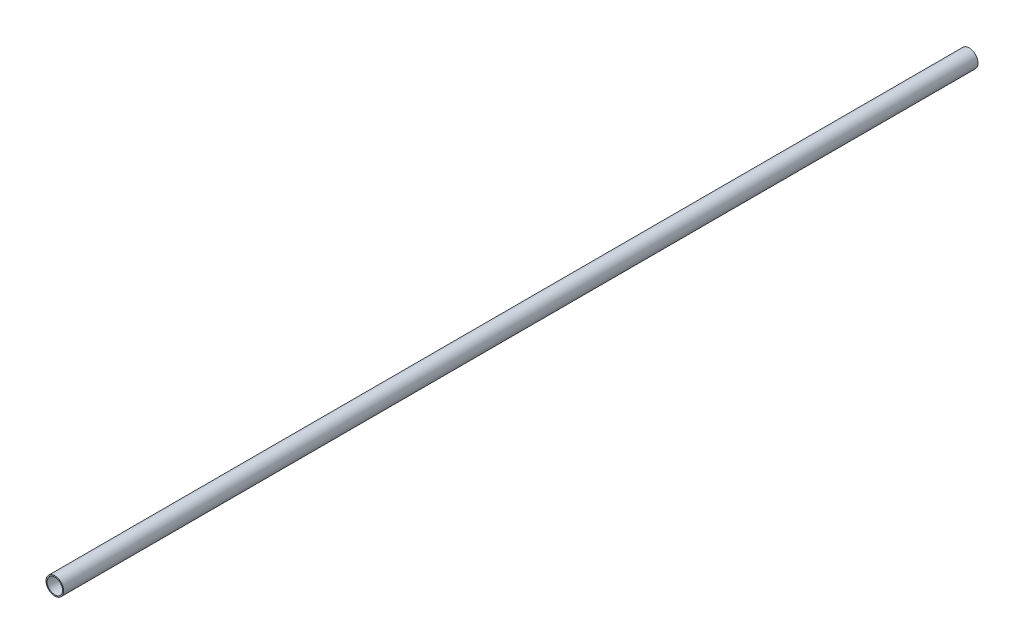
ISO-10303-21;
HEADER;
FILE_DESCRIPTION(('STEP AP214'),'2;1');
FILE_NAME('part.step','',(''),(''),'','','');
FILE_SCHEMA(('AUTOMOTIVE_DESIGN { 1 0 10303 214 1 1 1 1 }'));
ENDSEC;
DATA;
#1=APPLICATION_CONTEXT('core data for automotive mechanical design processes');
#2=APPLICATION_PROTOCOL_DEFINITION('international standard','automotive_design',2000,#1);
#3=PRODUCT_CONTEXT('',#1,'mechanical');
#4=PRODUCT('Part','Part','',(#3));
#5=PRODUCT_RELATED_PRODUCT_CATEGORY('part','',(#4));
#6=PRODUCT_DEFINITION_FORMATION('','',#4);
#7=PRODUCT_DEFINITION_CONTEXT('part definition',#1,'design');
#8=PRODUCT_DEFINITION('design','',#6,#7);
#9=PRODUCT_DEFINITION_SHAPE('','',#8);
#10=(LENGTH_UNIT() NAMED_UNIT(*) SI_UNIT(.MILLI.,.METRE.));
#11=(NAMED_UNIT(*) PLANE_ANGLE_UNIT() SI_UNIT($,.RADIAN.));
#12=(NAMED_UNIT(*) SI_UNIT($,.STERADIAN.) SOLID_ANGLE_UNIT());
#13=UNCERTAINTY_MEASURE_WITH_UNIT(LENGTH_MEASURE(1.E-05),#10,'distance_accuracy_value','');
#14=(GEOMETRIC_REPRESENTATION_CONTEXT(3) GLOBAL_UNCERTAINTY_ASSIGNED_CONTEXT((#13)) GLOBAL_UNIT_ASSIGNED_CONTEXT((#10,
#11,#12)) REPRESENTATION_CONTEXT('',''));
#15=CARTESIAN_POINT('',(0.,0.,0.));
#16=DIRECTION('',(0.,0.,1.));
#17=DIRECTION('',(1.,0.,0.));
#18=AXIS2_PLACEMENT_3D('',#15,#16,#17);
#19=CARTESIAN_POINT('',(2449.7201128805,-5187.00741573402,2500.));
#20=DIRECTION('',(0.,0.,1.));
#21=DIRECTION('',(1.,0.,0.));
#22=AXIS2_PLACEMENT_3D('',#19,#20,#21);
#23=PLANE('',#22);
#24=CARTESIAN_POINT('',(2449.7201128805,-5187.00741573402,2500.));
#25=DIRECTION('',(0.,0.,1.));
#26=DIRECTION('',(1.,0.,0.));
#27=AXIS2_PLACEMENT_3D('',#24,#25,#26);
#28=CIRCLE('',#27,24.125);
#29=CARTESIAN_POINT('',(2473.8451128805,-5187.00741573402,2500.));
#30=VERTEX_POINT('',#29);
#31=EDGE_CURVE('E10',#30,#30,#28,.T.);
#32=ORIENTED_EDGE('',*,*,#31,.T.);
#33=EDGE_LOOP('',(#32));
#34=FACE_BOUND('',#33,.T.);
#35=CARTESIAN_POINT('',(2449.7201128805,-5187.00741573402,2500.));
#36=DIRECTION('',(0.,0.,1.));
#37=DIRECTION('',(1.,0.,0.));
#38=AXIS2_PLACEMENT_3D('',#35,#36,#37);
#39=CIRCLE('',#38,21.0750000000002);
#40=CARTESIAN_POINT('',(2470.7951128805,-5187.00741573402,2500.));
#41=VERTEX_POINT('',#40);
#42=EDGE_CURVE('E43',#41,#41,#39,.T.);
#43=ORIENTED_EDGE('',*,*,#42,.F.);
#44=EDGE_LOOP('',(#43));
#45=FACE_BOUND('',#44,.T.);
#46=ADVANCED_FACE('F32',(#34,#45),#23,.T.);
#47=CARTESIAN_POINT('',(2449.7201128805,-5187.00741573402,0.));
#48=DIRECTION('',(0.,0.,1.));
#49=DIRECTION('',(1.,0.,0.));
#50=AXIS2_PLACEMENT_3D('',#47,#48,#49);
#51=PLANE('',#50);
#52=CARTESIAN_POINT('',(2449.7201128805,-5187.00741573402,0.));
#53=DIRECTION('',(0.,0.,1.));
#54=DIRECTION('',(1.,0.,0.));
#55=AXIS2_PLACEMENT_3D('',#52,#53,#54);
#56=CIRCLE('',#55,24.125);
#57=CARTESIAN_POINT('',(2473.8451128805,-5187.00741573402,0.));
#58=VERTEX_POINT('',#57);
#59=EDGE_CURVE('E36',#58,#58,#56,.T.);
#60=ORIENTED_EDGE('',*,*,#59,.F.);
#61=EDGE_LOOP('',(#60));
#62=FACE_BOUND('',#61,.T.);
#63=CARTESIAN_POINT('',(2449.7201128805,-5187.00741573402,0.));
#64=DIRECTION('',(0.,0.,1.));
#65=DIRECTION('',(1.,0.,0.));
#66=AXIS2_PLACEMENT_3D('',#63,#64,#65);
#67=CIRCLE('',#66,21.0750000000002);
#68=CARTESIAN_POINT('',(2470.7951128805,-5187.00741573402,0.));
#69=VERTEX_POINT('',#68);
#70=EDGE_CURVE('E45',#69,#69,#67,.T.);
#71=ORIENTED_EDGE('',*,*,#70,.T.);
#72=EDGE_LOOP('',(#71));
#73=FACE_BOUND('',#72,.T.);
#74=ADVANCED_FACE('F55',(#62,#73),#51,.F.);
#75=CARTESIAN_POINT('',(2449.7201128805,-5187.00741573402,2500.));
#76=DIRECTION('',(0.,0.,-1.));
#77=DIRECTION('',(-1.,0.,0.));
#78=AXIS2_PLACEMENT_3D('',#75,#76,#77);
#79=CYLINDRICAL_SURFACE('',#78,24.125);
#80=ORIENTED_EDGE('',*,*,#31,.F.);
#81=EDGE_LOOP('',(#80));
#82=FACE_BOUND('',#81,.T.);
#83=ORIENTED_EDGE('',*,*,#59,.T.);
#84=EDGE_LOOP('',(#83));
#85=FACE_BOUND('',#84,.T.);
#86=ADVANCED_FACE('F34',(#82,#85),#79,.T.);
#87=CARTESIAN_POINT('',(2449.7201128805,-5187.00741573402,2500.));
#88=DIRECTION('',(0.,0.,-1.));
#89=DIRECTION('',(-1.,0.,0.));
#90=AXIS2_PLACEMENT_3D('',#87,#88,#89);
#91=CYLINDRICAL_SURFACE('',#90,21.0750000000002);
#92=ORIENTED_EDGE('',*,*,#42,.T.);
#93=EDGE_LOOP('',(#92));
#94=FACE_BOUND('',#93,.T.);
#95=ORIENTED_EDGE('',*,*,#70,.F.);
#96=EDGE_LOOP('',(#95));
#97=FACE_BOUND('',#96,.T.);
#98=ADVANCED_FACE('F51',(#94,#97),#91,.F.);
#99=CLOSED_SHELL('',(#46,#74,#86,#98));
#100=MANIFOLD_SOLID_BREP('B2',#99);
#101=ADVANCED_BREP_SHAPE_REPRESENTATION('',(#18,#100),#14);
#102=SHAPE_DEFINITION_REPRESENTATION(#9,#101);
ENDSEC;
END-ISO-10303-21;
